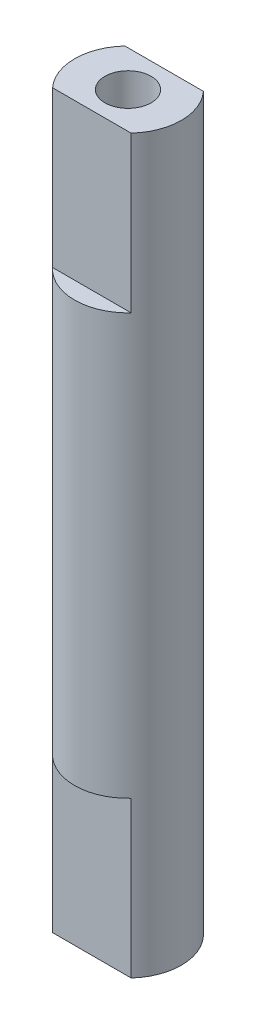
ISO-10303-21;
HEADER;
FILE_DESCRIPTION(('STEP AP214'),'2;1');
FILE_NAME('part.step','',(''),(''),'','','');
FILE_SCHEMA(('AUTOMOTIVE_DESIGN { 1 0 10303 214 1 1 1 1 }'));
ENDSEC;
DATA;
#1=APPLICATION_CONTEXT('core data for automotive mechanical design processes');
#2=APPLICATION_PROTOCOL_DEFINITION('international standard','automotive_design',2000,#1);
#3=PRODUCT_CONTEXT('',#1,'mechanical');
#4=PRODUCT('Part','Part','',(#3));
#5=PRODUCT_RELATED_PRODUCT_CATEGORY('part','',(#4));
#6=PRODUCT_DEFINITION_FORMATION('','',#4);
#7=PRODUCT_DEFINITION_CONTEXT('part definition',#1,'design');
#8=PRODUCT_DEFINITION('design','',#6,#7);
#9=PRODUCT_DEFINITION_SHAPE('','',#8);
#10=(LENGTH_UNIT() NAMED_UNIT(*) SI_UNIT(.MILLI.,.METRE.));
#11=(NAMED_UNIT(*) PLANE_ANGLE_UNIT() SI_UNIT($,.RADIAN.));
#12=(NAMED_UNIT(*) SI_UNIT($,.STERADIAN.) SOLID_ANGLE_UNIT());
#13=UNCERTAINTY_MEASURE_WITH_UNIT(LENGTH_MEASURE(1.E-05),#10,'distance_accuracy_value','');
#14=(GEOMETRIC_REPRESENTATION_CONTEXT(3) GLOBAL_UNCERTAINTY_ASSIGNED_CONTEXT((#13)) GLOBAL_UNIT_ASSIGNED_CONTEXT((#10,
#11,#12)) REPRESENTATION_CONTEXT('',''));
#15=CARTESIAN_POINT('',(0.,0.,0.));
#16=DIRECTION('',(0.,0.,1.));
#17=DIRECTION('',(1.,0.,0.));
#18=AXIS2_PLACEMENT_3D('',#15,#16,#17);
#19=CARTESIAN_POINT('',(0.,18.71,0.));
#20=DIRECTION('',(0.,1.,0.));
#21=DIRECTION('',(1.,0.,0.));
#22=AXIS2_PLACEMENT_3D('',#19,#20,#21);
#23=PLANE('',#22);
#24=CARTESIAN_POINT('',(0.,18.71,0.));
#25=DIRECTION('',(0.,-1.,0.));
#26=DIRECTION('',(-1.,0.,0.));
#27=AXIS2_PLACEMENT_3D('',#24,#25,#26);
#28=CIRCLE('',#27,1.18);
#29=CARTESIAN_POINT('',(1.18,18.71,0.));
#30=VERTEX_POINT('',#29);
#31=EDGE_CURVE('E236',#30,#30,#28,.T.);
#32=ORIENTED_EDGE('',*,*,#31,.T.);
#33=EDGE_LOOP('',(#32));
#34=FACE_BOUND('',#33,.T.);
#35=DIRECTION('',(1.,0.,0.));
#36=VECTOR('',#35,1.);
#37=CARTESIAN_POINT('',(-1.00379280730637,18.71,1.84999843850591));
#38=LINE('',#37,#36);
#39=CARTESIAN_POINT('',(-2.00758561461274,18.71,1.84999843850591));
#40=VERTEX_POINT('',#39);
#41=CARTESIAN_POINT('',(2.00758561461274,18.71,1.84999843850591));
#42=VERTEX_POINT('',#41);
#43=EDGE_CURVE('E193',#40,#42,#38,.T.);
#44=ORIENTED_EDGE('',*,*,#43,.T.);
#45=CARTESIAN_POINT('',(0.,18.71,0.));
#46=DIRECTION('',(0.,1.,0.));
#47=DIRECTION('',(1.,0.,0.));
#48=AXIS2_PLACEMENT_3D('',#45,#46,#47);
#49=CIRCLE('',#48,2.73);
#50=CARTESIAN_POINT('',(2.00758561461274,18.71,-1.85));
#51=VERTEX_POINT('',#50);
#52=EDGE_CURVE('E11',#42,#51,#49,.T.);
#53=ORIENTED_EDGE('',*,*,#52,.T.);
#54=DIRECTION('',(-1.,0.,0.));
#55=VECTOR('',#54,1.);
#56=CARTESIAN_POINT('',(1.00379280730637,18.71,-1.85));
#57=LINE('',#56,#55);
#58=CARTESIAN_POINT('',(-2.00758561461274,18.71,-1.85));
#59=VERTEX_POINT('',#58);
#60=EDGE_CURVE('E137',#51,#59,#57,.T.);
#61=ORIENTED_EDGE('',*,*,#60,.T.);
#62=CARTESIAN_POINT('',(0.,18.71,0.));
#63=DIRECTION('',(0.,1.,0.));
#64=DIRECTION('',(1.,0.,0.));
#65=AXIS2_PLACEMENT_3D('',#62,#63,#64);
#66=CIRCLE('',#65,2.73);
#67=CARTESIAN_POINT('',(-2.73,18.71,0.));
#68=VERTEX_POINT('',#67);
#69=EDGE_CURVE('E24',#59,#68,#66,.T.);
#70=ORIENTED_EDGE('',*,*,#69,.T.);
#71=CARTESIAN_POINT('',(0.,18.71,0.));
#72=DIRECTION('',(0.,1.,0.));
#73=DIRECTION('',(1.,0.,0.));
#74=AXIS2_PLACEMENT_3D('',#71,#72,#73);
#75=CIRCLE('',#74,2.73);
#76=EDGE_CURVE('E208',#68,#40,#75,.T.);
#77=ORIENTED_EDGE('',*,*,#76,.T.);
#78=EDGE_LOOP('',(#44,#53,#61,#70,#77));
#79=FACE_BOUND('',#78,.T.);
#80=ADVANCED_FACE('F16',(#34,#79),#23,.T.);
#81=CARTESIAN_POINT('',(0.,0.,0.));
#82=DIRECTION('',(0.,1.,0.));
#83=DIRECTION('',(1.,0.,0.));
#84=AXIS2_PLACEMENT_3D('',#81,#82,#83);
#85=CYLINDRICAL_SURFACE('',#84,2.73);
#86=DIRECTION('',(0.,-1.,0.));
#87=VECTOR('',#86,1.);
#88=CARTESIAN_POINT('',(2.00758705353608,0.,1.84999843850591));
#89=LINE('',#88,#87);
#90=CARTESIAN_POINT('',(2.00758561461274,10.75,1.84999843850591));
#91=VERTEX_POINT('',#90);
#92=EDGE_CURVE('E153',#42,#91,#89,.T.);
#93=ORIENTED_EDGE('',*,*,#92,.T.);
#94=CARTESIAN_POINT('',(0.,10.75,0.));
#95=DIRECTION('',(0.,-1.,0.));
#96=DIRECTION('',(1.,0.,0.));
#97=AXIS2_PLACEMENT_3D('',#94,#95,#96);
#98=CIRCLE('',#97,2.73);
#99=CARTESIAN_POINT('',(-2.00758561461274,10.75,1.84999843850591));
#100=VERTEX_POINT('',#99);
#101=EDGE_CURVE('E145',#91,#100,#98,.T.);
#102=ORIENTED_EDGE('',*,*,#101,.T.);
#103=DIRECTION('',(0.,1.,0.));
#104=VECTOR('',#103,1.);
#105=CARTESIAN_POINT('',(-2.00758705353608,0.,1.84999843850591));
#106=LINE('',#105,#104);
#107=EDGE_CURVE('E194',#100,#40,#106,.T.);
#108=ORIENTED_EDGE('',*,*,#107,.T.);
#109=ORIENTED_EDGE('',*,*,#76,.F.);
#110=DIRECTION('',(0.,-1.,0.));
#111=VECTOR('',#110,1.);
#112=CARTESIAN_POINT('',(-2.73,0.,0.));
#113=LINE('',#112,#111);
#114=CARTESIAN_POINT('',(-2.73,-18.71,0.));
#115=VERTEX_POINT('',#114);
#116=EDGE_CURVE('E129',#68,#115,#113,.T.);
#117=ORIENTED_EDGE('',*,*,#116,.T.);
#118=CARTESIAN_POINT('',(0.,-18.71,0.));
#119=DIRECTION('',(0.,-1.,0.));
#120=DIRECTION('',(1.,0.,0.));
#121=AXIS2_PLACEMENT_3D('',#118,#119,#120);
#122=CIRCLE('',#121,2.73);
#123=CARTESIAN_POINT('',(-2.00758561461274,-18.71,1.84999843850591));
#124=VERTEX_POINT('',#123);
#125=EDGE_CURVE('E186',#124,#115,#122,.T.);
#126=ORIENTED_EDGE('',*,*,#125,.F.);
#127=DIRECTION('',(0.,1.,0.));
#128=VECTOR('',#127,1.);
#129=CARTESIAN_POINT('',(-2.00758705353608,0.,1.84999843850591));
#130=LINE('',#129,#128);
#131=CARTESIAN_POINT('',(-2.00758561461274,-10.75,1.84999843850591));
#132=VERTEX_POINT('',#131);
#133=EDGE_CURVE('E168',#124,#132,#130,.T.);
#134=ORIENTED_EDGE('',*,*,#133,.T.);
#135=CARTESIAN_POINT('',(0.,-10.75,0.));
#136=DIRECTION('',(0.,1.,0.));
#137=DIRECTION('',(1.,0.,0.));
#138=AXIS2_PLACEMENT_3D('',#135,#136,#137);
#139=CIRCLE('',#138,2.73);
#140=CARTESIAN_POINT('',(2.00758561461274,-10.75,1.84999843850591));
#141=VERTEX_POINT('',#140);
#142=EDGE_CURVE('E164',#132,#141,#139,.T.);
#143=ORIENTED_EDGE('',*,*,#142,.T.);
#144=DIRECTION('',(0.,-1.,0.));
#145=VECTOR('',#144,1.);
#146=CARTESIAN_POINT('',(2.00758705353608,0.,1.84999843850591));
#147=LINE('',#146,#145);
#148=CARTESIAN_POINT('',(2.00758561461274,-18.71,1.84999843850591));
#149=VERTEX_POINT('',#148);
#150=EDGE_CURVE('E179',#141,#149,#147,.T.);
#151=ORIENTED_EDGE('',*,*,#150,.T.);
#152=CARTESIAN_POINT('',(0.,-18.71,0.));
#153=DIRECTION('',(0.,-1.,0.));
#154=DIRECTION('',(1.,0.,0.));
#155=AXIS2_PLACEMENT_3D('',#152,#153,#154);
#156=CIRCLE('',#155,2.73);
#157=CARTESIAN_POINT('',(2.00758561461274,-18.71,-1.85));
#158=VERTEX_POINT('',#157);
#159=EDGE_CURVE('E167',#158,#149,#156,.T.);
#160=ORIENTED_EDGE('',*,*,#159,.F.);
#161=DIRECTION('',(0.,1.,0.));
#162=VECTOR('',#161,1.);
#163=CARTESIAN_POINT('',(2.00758561461274,0.,-1.85));
#164=LINE('',#163,#162);
#165=CARTESIAN_POINT('',(2.00758561461274,-10.75,-1.85));
#166=VERTEX_POINT('',#165);
#167=EDGE_CURVE('E157',#158,#166,#164,.T.);
#168=ORIENTED_EDGE('',*,*,#167,.T.);
#169=CARTESIAN_POINT('',(0.,-10.75,0.));
#170=DIRECTION('',(0.,1.,0.));
#171=DIRECTION('',(1.,0.,0.));
#172=AXIS2_PLACEMENT_3D('',#169,#170,#171);
#173=CIRCLE('',#172,2.73);
#174=CARTESIAN_POINT('',(-2.00758561461274,-10.75,-1.85));
#175=VERTEX_POINT('',#174);
#176=EDGE_CURVE('E169',#166,#175,#173,.T.);
#177=ORIENTED_EDGE('',*,*,#176,.T.);
#178=DIRECTION('',(0.,-1.,0.));
#179=VECTOR('',#178,1.);
#180=CARTESIAN_POINT('',(-2.00758561461274,0.,-1.85));
#181=LINE('',#180,#179);
#182=CARTESIAN_POINT('',(-2.00758561461274,-18.71,-1.85));
#183=VERTEX_POINT('',#182);
#184=EDGE_CURVE('E159',#175,#183,#181,.T.);
#185=ORIENTED_EDGE('',*,*,#184,.T.);
#186=CARTESIAN_POINT('',(0.,-18.71,0.));
#187=DIRECTION('',(0.,-1.,0.));
#188=DIRECTION('',(1.,0.,0.));
#189=AXIS2_PLACEMENT_3D('',#186,#187,#188);
#190=CIRCLE('',#189,2.73);
#191=EDGE_CURVE('E190',#115,#183,#190,.T.);
#192=ORIENTED_EDGE('',*,*,#191,.F.);
#193=ORIENTED_EDGE('',*,*,#116,.F.);
#194=ORIENTED_EDGE('',*,*,#69,.F.);
#195=DIRECTION('',(0.,-1.,0.));
#196=VECTOR('',#195,1.);
#197=CARTESIAN_POINT('',(-2.00758561461274,0.,-1.85));
#198=LINE('',#197,#196);
#199=CARTESIAN_POINT('',(-2.00758561461274,10.75,-1.85));
#200=VERTEX_POINT('',#199);
#201=EDGE_CURVE('E126',#59,#200,#198,.T.);
#202=ORIENTED_EDGE('',*,*,#201,.T.);
#203=CARTESIAN_POINT('',(0.,10.75,0.));
#204=DIRECTION('',(0.,-1.,0.));
#205=DIRECTION('',(1.,0.,0.));
#206=AXIS2_PLACEMENT_3D('',#203,#204,#205);
#207=CIRCLE('',#206,2.73);
#208=CARTESIAN_POINT('',(2.00758561461274,10.75,-1.85));
#209=VERTEX_POINT('',#208);
#210=EDGE_CURVE('E47',#200,#209,#207,.T.);
#211=ORIENTED_EDGE('',*,*,#210,.T.);
#212=DIRECTION('',(0.,1.,0.));
#213=VECTOR('',#212,1.);
#214=CARTESIAN_POINT('',(2.00758561461274,0.,-1.85));
#215=LINE('',#214,#213);
#216=EDGE_CURVE('E144',#209,#51,#215,.T.);
#217=ORIENTED_EDGE('',*,*,#216,.T.);
#218=ORIENTED_EDGE('',*,*,#52,.F.);
#219=EDGE_LOOP('',(#93,#102,#108,#109,#117,#126,#134,#143,#151,#160,#168,#177,#185,#192,#193,
#194,#202,#211,#217,#218));
#220=FACE_BOUND('',#219,.T.);
#221=ADVANCED_FACE('F125',(#220),#85,.T.);
#222=CARTESIAN_POINT('',(0.,10.75,-2.29));
#223=DIRECTION('',(0.,1.,0.));
#224=DIRECTION('',(1.,0.,0.));
#225=AXIS2_PLACEMENT_3D('',#222,#223,#224);
#226=PLANE('',#225);
#227=DIRECTION('',(-1.,0.,0.));
#228=VECTOR('',#227,1.);
#229=CARTESIAN_POINT('',(-2.00758561461274,10.75,-1.85));
#230=LINE('',#229,#228);
#231=EDGE_CURVE('E138',#209,#200,#230,.T.);
#232=ORIENTED_EDGE('',*,*,#231,.F.);
#233=ORIENTED_EDGE('',*,*,#210,.F.);
#234=EDGE_LOOP('',(#232,#233));
#235=FACE_BOUND('',#234,.T.);
#236=ADVANCED_FACE('F268',(#235),#226,.T.);
#237=CARTESIAN_POINT('',(2.00758561461274,18.71,-1.85));
#238=DIRECTION('',(0.,0.,1.));
#239=DIRECTION('',(1.,0.,0.));
#240=AXIS2_PLACEMENT_3D('',#237,#238,#239);
#241=PLANE('',#240);
#242=ORIENTED_EDGE('',*,*,#60,.F.);
#243=ORIENTED_EDGE('',*,*,#216,.F.);
#244=ORIENTED_EDGE('',*,*,#231,.T.);
#245=ORIENTED_EDGE('',*,*,#201,.F.);
#246=EDGE_LOOP('',(#242,#243,#244,#245));
#247=FACE_BOUND('',#246,.T.);
#248=ADVANCED_FACE('F135',(#247),#241,.F.);
#249=CARTESIAN_POINT('',(0.,10.75,2.28999921925296));
#250=DIRECTION('',(0.,1.,0.));
#251=DIRECTION('',(1.,0.,0.));
#252=AXIS2_PLACEMENT_3D('',#249,#250,#251);
#253=PLANE('',#252);
#254=ORIENTED_EDGE('',*,*,#101,.F.);
#255=DIRECTION('',(1.,0.,0.));
#256=VECTOR('',#255,1.);
#257=CARTESIAN_POINT('',(-2.00758561461274,10.75,1.84999843850591));
#258=LINE('',#257,#256);
#259=EDGE_CURVE('E197',#100,#91,#258,.T.);
#260=ORIENTED_EDGE('',*,*,#259,.F.);
#261=EDGE_LOOP('',(#254,#260));
#262=FACE_BOUND('',#261,.T.);
#263=ADVANCED_FACE('F307',(#262),#253,.T.);
#264=CARTESIAN_POINT('',(-2.00758561461274,18.71,1.84999843850591));
#265=DIRECTION('',(0.,0.,-1.));
#266=DIRECTION('',(-1.,0.,0.));
#267=AXIS2_PLACEMENT_3D('',#264,#265,#266);
#268=PLANE('',#267);
#269=ORIENTED_EDGE('',*,*,#43,.F.);
#270=ORIENTED_EDGE('',*,*,#107,.F.);
#271=ORIENTED_EDGE('',*,*,#259,.T.);
#272=ORIENTED_EDGE('',*,*,#92,.F.);
#273=EDGE_LOOP('',(#269,#270,#271,#272));
#274=FACE_BOUND('',#273,.T.);
#275=ADVANCED_FACE('F305',(#274),#268,.F.);
#276=CARTESIAN_POINT('',(0.,-18.71,0.));
#277=DIRECTION('',(0.,1.,0.));
#278=DIRECTION('',(1.,0.,0.));
#279=AXIS2_PLACEMENT_3D('',#276,#277,#278);
#280=PLANE('',#279);
#281=CARTESIAN_POINT('',(0.,-18.71,0.));
#282=DIRECTION('',(0.,1.,0.));
#283=DIRECTION('',(-1.,0.,0.));
#284=AXIS2_PLACEMENT_3D('',#281,#282,#283);
#285=CIRCLE('',#284,1.18);
#286=CARTESIAN_POINT('',(1.18,-18.71,0.));
#287=VERTEX_POINT('',#286);
#288=EDGE_CURVE('E285',#287,#287,#285,.T.);
#289=ORIENTED_EDGE('',*,*,#288,.T.);
#290=EDGE_LOOP('',(#289));
#291=FACE_BOUND('',#290,.T.);
#292=DIRECTION('',(1.,0.,0.));
#293=VECTOR('',#292,1.);
#294=CARTESIAN_POINT('',(-1.00379280730637,-18.71,-1.85));
#295=LINE('',#294,#293);
#296=EDGE_CURVE('E163',#183,#158,#295,.T.);
#297=ORIENTED_EDGE('',*,*,#296,.T.);
#298=ORIENTED_EDGE('',*,*,#159,.T.);
#299=DIRECTION('',(-1.,0.,0.));
#300=VECTOR('',#299,1.);
#301=CARTESIAN_POINT('',(1.00379280730637,-18.71,1.84999843850591));
#302=LINE('',#301,#300);
#303=EDGE_CURVE('E172',#149,#124,#302,.T.);
#304=ORIENTED_EDGE('',*,*,#303,.T.);
#305=ORIENTED_EDGE('',*,*,#125,.T.);
#306=ORIENTED_EDGE('',*,*,#191,.T.);
#307=EDGE_LOOP('',(#297,#298,#304,#305,#306));
#308=FACE_BOUND('',#307,.T.);
#309=ADVANCED_FACE('F217',(#291,#308),#280,.F.);
#310=CARTESIAN_POINT('',(0.,-10.75,0.));
#311=DIRECTION('',(0.,-1.,0.));
#312=DIRECTION('',(0.,0.,-1.));
#313=AXIS2_PLACEMENT_3D('',#310,#311,#312);
#314=PLANE('',#313);
#315=DIRECTION('',(-1.,0.,0.));
#316=VECTOR('',#315,1.);
#317=CARTESIAN_POINT('',(-1.00379280730637,-10.75,1.84999843850591));
#318=LINE('',#317,#316);
#319=EDGE_CURVE('E183',#141,#132,#318,.T.);
#320=ORIENTED_EDGE('',*,*,#319,.F.);
#321=ORIENTED_EDGE('',*,*,#142,.F.);
#322=EDGE_LOOP('',(#320,#321));
#323=FACE_BOUND('',#322,.T.);
#324=ADVANCED_FACE('F226',(#323),#314,.T.);
#325=CARTESIAN_POINT('',(2.00758561461274,-18.71,1.84999843850591));
#326=DIRECTION('',(0.,0.,-1.));
#327=DIRECTION('',(-1.,0.,0.));
#328=AXIS2_PLACEMENT_3D('',#325,#326,#327);
#329=PLANE('',#328);
#330=ORIENTED_EDGE('',*,*,#303,.F.);
#331=ORIENTED_EDGE('',*,*,#150,.F.);
#332=ORIENTED_EDGE('',*,*,#319,.T.);
#333=ORIENTED_EDGE('',*,*,#133,.F.);
#334=EDGE_LOOP('',(#330,#331,#332,#333));
#335=FACE_BOUND('',#334,.T.);
#336=ADVANCED_FACE('F222',(#335),#329,.F.);
#337=CARTESIAN_POINT('',(0.,-10.75,0.));
#338=DIRECTION('',(0.,-1.,0.));
#339=DIRECTION('',(0.,0.,-1.));
#340=AXIS2_PLACEMENT_3D('',#337,#338,#339);
#341=PLANE('',#340);
#342=ORIENTED_EDGE('',*,*,#176,.F.);
#343=DIRECTION('',(1.,0.,0.));
#344=VECTOR('',#343,1.);
#345=CARTESIAN_POINT('',(1.00379280730637,-10.75,-1.85));
#346=LINE('',#345,#344);
#347=EDGE_CURVE('E162',#175,#166,#346,.T.);
#348=ORIENTED_EDGE('',*,*,#347,.F.);
#349=EDGE_LOOP('',(#342,#348));
#350=FACE_BOUND('',#349,.T.);
#351=ADVANCED_FACE('F251',(#350),#341,.T.);
#352=CARTESIAN_POINT('',(-2.00758561461274,-18.71,-1.85));
#353=DIRECTION('',(0.,0.,1.));
#354=DIRECTION('',(1.,0.,0.));
#355=AXIS2_PLACEMENT_3D('',#352,#353,#354);
#356=PLANE('',#355);
#357=ORIENTED_EDGE('',*,*,#296,.F.);
#358=ORIENTED_EDGE('',*,*,#184,.F.);
#359=ORIENTED_EDGE('',*,*,#347,.T.);
#360=ORIENTED_EDGE('',*,*,#167,.F.);
#361=EDGE_LOOP('',(#357,#358,#359,#360));
#362=FACE_BOUND('',#361,.T.);
#363=ADVANCED_FACE('F244',(#362),#356,.F.);
#364=CARTESIAN_POINT('',(0.,12.75,0.));
#365=DIRECTION('',(0.,1.,0.));
#366=DIRECTION('',(1.,0.,0.));
#367=AXIS2_PLACEMENT_3D('',#364,#365,#366);
#368=PLANE('',#367);
#369=CARTESIAN_POINT('',(0.,12.75,0.));
#370=DIRECTION('',(0.,-1.,0.));
#371=DIRECTION('',(-1.,0.,0.));
#372=AXIS2_PLACEMENT_3D('',#369,#370,#371);
#373=CIRCLE('',#372,1.18);
#374=CARTESIAN_POINT('',(1.18,12.75,0.));
#375=VERTEX_POINT('',#374);
#376=EDGE_CURVE('E238',#375,#375,#373,.T.);
#377=ORIENTED_EDGE('',*,*,#376,.F.);
#378=EDGE_LOOP('',(#377));
#379=FACE_BOUND('',#378,.T.);
#380=ADVANCED_FACE('F259',(#379),#368,.T.);
#381=CARTESIAN_POINT('',(0.,18.71,0.));
#382=DIRECTION('',(0.,-1.,0.));
#383=DIRECTION('',(-1.,0.,0.));
#384=AXIS2_PLACEMENT_3D('',#381,#382,#383);
#385=CYLINDRICAL_SURFACE('',#384,1.18);
#386=ORIENTED_EDGE('',*,*,#31,.F.);
#387=DIRECTION('',(0.,-1.,0.));
#388=VECTOR('',#387,1.);
#389=CARTESIAN_POINT('',(1.18,18.71,0.));
#390=LINE('',#389,#388);
#391=EDGE_CURVE('E239',#30,#375,#390,.T.);
#392=ORIENTED_EDGE('',*,*,#391,.T.);
#393=ORIENTED_EDGE('',*,*,#376,.T.);
#394=ORIENTED_EDGE('',*,*,#391,.F.);
#395=EDGE_LOOP('',(#386,#392,#393,#394));
#396=FACE_BOUND('',#395,.T.);
#397=ADVANCED_FACE('F301',(#396),#385,.F.);
#398=CARTESIAN_POINT('',(0.,-12.75,0.));
#399=DIRECTION('',(0.,-1.,0.));
#400=DIRECTION('',(0.,0.,-1.));
#401=AXIS2_PLACEMENT_3D('',#398,#399,#400);
#402=PLANE('',#401);
#403=CARTESIAN_POINT('',(0.,-12.75,0.));
#404=DIRECTION('',(0.,1.,0.));
#405=DIRECTION('',(-1.,0.,0.));
#406=AXIS2_PLACEMENT_3D('',#403,#404,#405);
#407=CIRCLE('',#406,1.18);
#408=CARTESIAN_POINT('',(1.18,-12.75,0.));
#409=VERTEX_POINT('',#408);
#410=EDGE_CURVE('E273',#409,#409,#407,.T.);
#411=ORIENTED_EDGE('',*,*,#410,.F.);
#412=EDGE_LOOP('',(#411));
#413=FACE_BOUND('',#412,.T.);
#414=ADVANCED_FACE('F296',(#413),#402,.T.);
#415=CARTESIAN_POINT('',(0.,-18.71,0.));
#416=DIRECTION('',(0.,1.,0.));
#417=DIRECTION('',(-1.,0.,0.));
#418=AXIS2_PLACEMENT_3D('',#415,#416,#417);
#419=CYLINDRICAL_SURFACE('',#418,1.18);
#420=ORIENTED_EDGE('',*,*,#288,.F.);
#421=DIRECTION('',(0.,1.,0.));
#422=VECTOR('',#421,1.);
#423=CARTESIAN_POINT('',(1.18,-18.71,0.));
#424=LINE('',#423,#422);
#425=EDGE_CURVE('E277',#287,#409,#424,.T.);
#426=ORIENTED_EDGE('',*,*,#425,.T.);
#427=ORIENTED_EDGE('',*,*,#410,.T.);
#428=ORIENTED_EDGE('',*,*,#425,.F.);
#429=EDGE_LOOP('',(#420,#426,#427,#428));
#430=FACE_BOUND('',#429,.T.);
#431=ADVANCED_FACE('F294',(#430),#419,.F.);
#432=CLOSED_SHELL('',(#80,#221,#236,#248,#263,#275,#309,#324,#336,#351,#363,#380,#397,#414,#431));
#433=MANIFOLD_SOLID_BREP('B1',#432);
#434=ADVANCED_BREP_SHAPE_REPRESENTATION('',(#18,#433),#14);
#435=SHAPE_DEFINITION_REPRESENTATION(#9,#434);
ENDSEC;
END-ISO-10303-21;
